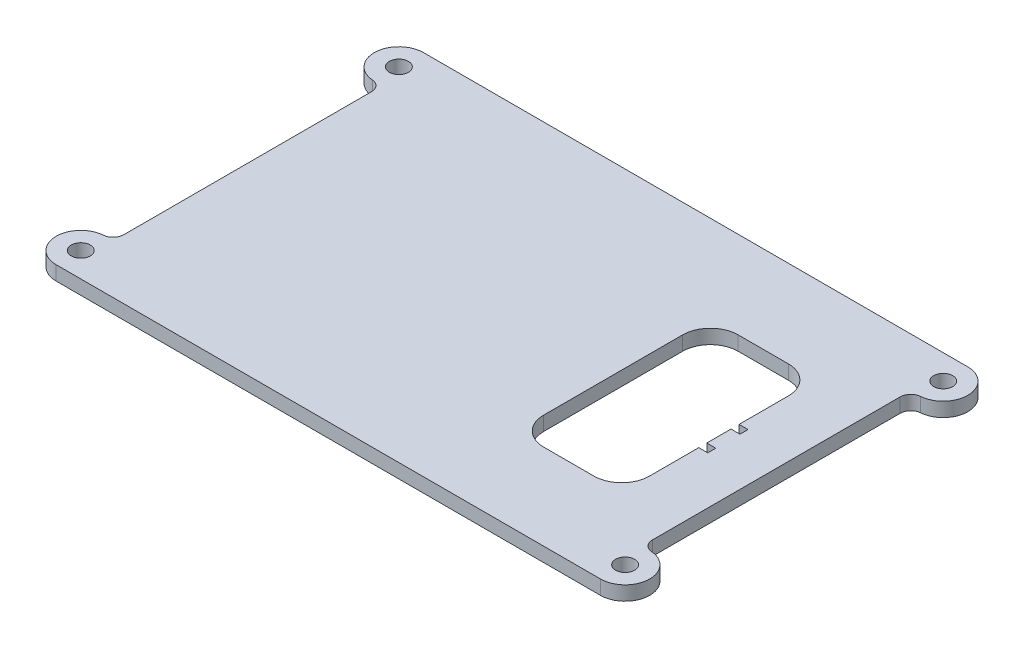
ISO-10303-21;
HEADER;
FILE_DESCRIPTION(('STEP AP214'),'2;1');
FILE_NAME('part.step','',(''),(''),'','','');
FILE_SCHEMA(('AUTOMOTIVE_DESIGN { 1 0 10303 214 1 1 1 1 }'));
ENDSEC;
DATA;
#1=APPLICATION_CONTEXT('core data for automotive mechanical design processes');
#2=APPLICATION_PROTOCOL_DEFINITION('international standard','automotive_design',2000,#1);
#3=PRODUCT_CONTEXT('',#1,'mechanical');
#4=PRODUCT('Part','Part','',(#3));
#5=PRODUCT_RELATED_PRODUCT_CATEGORY('part','',(#4));
#6=PRODUCT_DEFINITION_FORMATION('','',#4);
#7=PRODUCT_DEFINITION_CONTEXT('part definition',#1,'design');
#8=PRODUCT_DEFINITION('design','',#6,#7);
#9=PRODUCT_DEFINITION_SHAPE('','',#8);
#10=(LENGTH_UNIT() NAMED_UNIT(*) SI_UNIT(.MILLI.,.METRE.));
#11=(NAMED_UNIT(*) PLANE_ANGLE_UNIT() SI_UNIT($,.RADIAN.));
#12=(NAMED_UNIT(*) SI_UNIT($,.STERADIAN.) SOLID_ANGLE_UNIT());
#13=UNCERTAINTY_MEASURE_WITH_UNIT(LENGTH_MEASURE(1.E-05),#10,'distance_accuracy_value','');
#14=(GEOMETRIC_REPRESENTATION_CONTEXT(3) GLOBAL_UNCERTAINTY_ASSIGNED_CONTEXT((#13)) GLOBAL_UNIT_ASSIGNED_CONTEXT((#10,
#11,#12)) REPRESENTATION_CONTEXT('',''));
#15=CARTESIAN_POINT('',(0.,0.,0.));
#16=DIRECTION('',(0.,0.,1.));
#17=DIRECTION('',(1.,0.,0.));
#18=AXIS2_PLACEMENT_3D('',#15,#16,#17);
#19=CARTESIAN_POINT('',(0.,3.175,-39.380165211129));
#20=DIRECTION('',(0.,0.,1.));
#21=DIRECTION('',(1.,0.,0.));
#22=AXIS2_PLACEMENT_3D('',#19,#20,#21);
#23=PLANE('',#22);
#24=DIRECTION('',(-1.,0.,0.));
#25=VECTOR('',#24,1.);
#26=CARTESIAN_POINT('',(0.,0.,-39.380165211129));
#27=LINE('',#26,#25);
#28=CARTESIAN_POINT('',(54.5819086761113,0.,-39.380165211129));
#29=VERTEX_POINT('',#28);
#30=CARTESIAN_POINT('',(-66.9180913238887,0.,-39.380165211129));
#31=VERTEX_POINT('',#30);
#32=EDGE_CURVE('E319',#29,#31,#27,.T.);
#33=ORIENTED_EDGE('',*,*,#32,.T.);
#34=DIRECTION('',(0.,-1.,0.));
#35=VECTOR('',#34,1.);
#36=CARTESIAN_POINT('',(-66.9180913238887,3.175,-39.380165211129));
#37=LINE('',#36,#35);
#38=CARTESIAN_POINT('',(-66.9180913238887,3.175,-39.380165211129));
#39=VERTEX_POINT('',#38);
#40=EDGE_CURVE('E11',#39,#31,#37,.T.);
#41=ORIENTED_EDGE('',*,*,#40,.F.);
#42=DIRECTION('',(-1.,0.,0.));
#43=VECTOR('',#42,1.);
#44=CARTESIAN_POINT('',(0.,3.175,-39.380165211129));
#45=LINE('',#44,#43);
#46=CARTESIAN_POINT('',(54.5819086761113,3.175,-39.380165211129));
#47=VERTEX_POINT('',#46);
#48=EDGE_CURVE('E463',#47,#39,#45,.T.);
#49=ORIENTED_EDGE('',*,*,#48,.F.);
#50=DIRECTION('',(0.,-1.,0.));
#51=VECTOR('',#50,1.);
#52=CARTESIAN_POINT('',(54.5819086761113,3.175,-39.380165211129));
#53=LINE('',#52,#51);
#54=EDGE_CURVE('E349',#47,#29,#53,.T.);
#55=ORIENTED_EDGE('',*,*,#54,.T.);
#56=EDGE_LOOP('',(#33,#41,#49,#55));
#57=FACE_BOUND('',#56,.T.);
#58=ADVANCED_FACE('F41',(#57),#23,.F.);
#59=CARTESIAN_POINT('',(-66.9180913238887,3.175,-33.880165211129));
#60=DIRECTION('',(0.,-1.,0.));
#61=DIRECTION('',(0.,0.,-1.));
#62=AXIS2_PLACEMENT_3D('',#59,#60,#61);
#63=CYLINDRICAL_SURFACE('',#62,5.5);
#64=CARTESIAN_POINT('',(-66.9180913238887,0.,-33.880165211129));
#65=DIRECTION('',(0.,1.,0.));
#66=DIRECTION('',(0.,0.,1.));
#67=AXIS2_PLACEMENT_3D('',#64,#65,#66);
#68=CIRCLE('',#67,5.5);
#69=CARTESIAN_POINT('',(-67.3578121360715,0.,-28.3977710619153));
#70=VERTEX_POINT('',#69);
#71=EDGE_CURVE('E322',#31,#70,#68,.T.);
#72=ORIENTED_EDGE('',*,*,#71,.T.);
#73=DIRECTION('',(0.,-1.,0.));
#74=VECTOR('',#73,1.);
#75=CARTESIAN_POINT('',(-67.3578121360715,3.175,-28.3977710619153));
#76=LINE('',#75,#74);
#77=CARTESIAN_POINT('',(-67.3578121360715,3.175,-28.3977710619153));
#78=VERTEX_POINT('',#77);
#79=EDGE_CURVE('E51',#78,#70,#76,.T.);
#80=ORIENTED_EDGE('',*,*,#79,.F.);
#81=CARTESIAN_POINT('',(-66.9180913238887,3.175,-33.880165211129));
#82=DIRECTION('',(0.,1.,0.));
#83=DIRECTION('',(0.,0.,1.));
#84=AXIS2_PLACEMENT_3D('',#81,#82,#83);
#85=CIRCLE('',#84,5.5);
#86=EDGE_CURVE('E465',#39,#78,#85,.T.);
#87=ORIENTED_EDGE('',*,*,#86,.F.);
#88=ORIENTED_EDGE('',*,*,#40,.T.);
#89=EDGE_LOOP('',(#72,#80,#87,#88));
#90=FACE_BOUND('',#89,.T.);
#91=ADVANCED_FACE('F503',(#90),#63,.T.);
#92=CARTESIAN_POINT('',(-67.5480913238888,3.175,-26.0253895937101));
#93=DIRECTION('',(0.,-1.,0.));
#94=DIRECTION('',(0.,0.,-1.));
#95=AXIS2_PLACEMENT_3D('',#92,#93,#94);
#96=CYLINDRICAL_SURFACE('',#95,2.38);
#97=CARTESIAN_POINT('',(-67.5480913238888,0.,-26.0253895937101));
#98=DIRECTION('',(0.,1.,0.));
#99=DIRECTION('',(0.,0.,1.));
#100=AXIS2_PLACEMENT_3D('',#97,#98,#99);
#101=CIRCLE('',#100,2.38);
#102=CARTESIAN_POINT('',(-65.1680913238887,0.,-26.0253895937101));
#103=VERTEX_POINT('',#102);
#104=EDGE_CURVE('E325',#103,#70,#101,.T.);
#105=ORIENTED_EDGE('',*,*,#104,.F.);
#106=DIRECTION('',(0.,-1.,0.));
#107=VECTOR('',#106,1.);
#108=CARTESIAN_POINT('',(-65.1680913238887,3.175,-26.0253895937101));
#109=LINE('',#108,#107);
#110=CARTESIAN_POINT('',(-65.1680913238887,3.175,-26.0253895937101));
#111=VERTEX_POINT('',#110);
#112=EDGE_CURVE('E365',#111,#103,#109,.T.);
#113=ORIENTED_EDGE('',*,*,#112,.F.);
#114=CARTESIAN_POINT('',(-67.5480913238888,3.175,-26.0253895937101));
#115=DIRECTION('',(0.,1.,0.));
#116=DIRECTION('',(0.,0.,1.));
#117=AXIS2_PLACEMENT_3D('',#114,#115,#116);
#118=CIRCLE('',#117,2.38);
#119=EDGE_CURVE('E467',#111,#78,#118,.T.);
#120=ORIENTED_EDGE('',*,*,#119,.T.);
#121=ORIENTED_EDGE('',*,*,#79,.T.);
#122=EDGE_LOOP('',(#105,#113,#120,#121));
#123=FACE_BOUND('',#122,.T.);
#124=ADVANCED_FACE('F508',(#123),#96,.F.);
#125=CARTESIAN_POINT('',(-65.1680913238887,3.175,0.));
#126=DIRECTION('',(1.,0.,0.));
#127=DIRECTION('',(0.,0.,-1.));
#128=AXIS2_PLACEMENT_3D('',#125,#126,#127);
#129=PLANE('',#128);
#130=DIRECTION('',(0.,0.,1.));
#131=VECTOR('',#130,1.);
#132=CARTESIAN_POINT('',(-65.1680913238887,0.,0.));
#133=LINE('',#132,#131);
#134=CARTESIAN_POINT('',(-65.1680913238887,0.,29.265059171452));
#135=VERTEX_POINT('',#134);
#136=EDGE_CURVE('E328',#103,#135,#133,.T.);
#137=ORIENTED_EDGE('',*,*,#136,.T.);
#138=DIRECTION('',(0.,-1.,0.));
#139=VECTOR('',#138,1.);
#140=CARTESIAN_POINT('',(-65.1680913238887,3.175,29.265059171452));
#141=LINE('',#140,#139);
#142=CARTESIAN_POINT('',(-65.1680913238887,3.175,29.265059171452));
#143=VERTEX_POINT('',#142);
#144=EDGE_CURVE('E363',#143,#135,#141,.T.);
#145=ORIENTED_EDGE('',*,*,#144,.F.);
#146=DIRECTION('',(0.,0.,1.));
#147=VECTOR('',#146,1.);
#148=CARTESIAN_POINT('',(-65.1680913238887,3.175,0.));
#149=LINE('',#148,#147);
#150=EDGE_CURVE('E470',#111,#143,#149,.T.);
#151=ORIENTED_EDGE('',*,*,#150,.F.);
#152=ORIENTED_EDGE('',*,*,#112,.T.);
#153=EDGE_LOOP('',(#137,#145,#151,#152));
#154=FACE_BOUND('',#153,.T.);
#155=ADVANCED_FACE('F789',(#154),#129,.F.);
#156=CARTESIAN_POINT('',(-67.5480913238887,3.175,29.265059171452));
#157=DIRECTION('',(0.,-1.,0.));
#158=DIRECTION('',(0.,0.,-1.));
#159=AXIS2_PLACEMENT_3D('',#156,#157,#158);
#160=CYLINDRICAL_SURFACE('',#159,2.38);
#161=CARTESIAN_POINT('',(-67.5480913238887,0.,29.265059171452));
#162=DIRECTION('',(0.,1.,0.));
#163=DIRECTION('',(0.,0.,1.));
#164=AXIS2_PLACEMENT_3D('',#161,#162,#163);
#165=CIRCLE('',#164,2.38);
#166=CARTESIAN_POINT('',(-67.3578121360715,0.,31.6374406396572));
#167=VERTEX_POINT('',#166);
#168=EDGE_CURVE('E331',#167,#135,#165,.T.);
#169=ORIENTED_EDGE('',*,*,#168,.F.);
#170=DIRECTION('',(0.,-1.,0.));
#171=VECTOR('',#170,1.);
#172=CARTESIAN_POINT('',(-67.3578121360715,3.175,31.6374406396572));
#173=LINE('',#172,#171);
#174=CARTESIAN_POINT('',(-67.3578121360715,3.175,31.6374406396572));
#175=VERTEX_POINT('',#174);
#176=EDGE_CURVE('E361',#175,#167,#173,.T.);
#177=ORIENTED_EDGE('',*,*,#176,.F.);
#178=CARTESIAN_POINT('',(-67.5480913238887,3.175,29.265059171452));
#179=DIRECTION('',(0.,1.,0.));
#180=DIRECTION('',(0.,0.,1.));
#181=AXIS2_PLACEMENT_3D('',#178,#179,#180);
#182=CIRCLE('',#181,2.38);
#183=EDGE_CURVE('E472',#175,#143,#182,.T.);
#184=ORIENTED_EDGE('',*,*,#183,.T.);
#185=ORIENTED_EDGE('',*,*,#144,.T.);
#186=EDGE_LOOP('',(#169,#177,#184,#185));
#187=FACE_BOUND('',#186,.T.);
#188=ADVANCED_FACE('F779',(#187),#160,.F.);
#189=CARTESIAN_POINT('',(-66.9180913238887,3.175,37.119834788871));
#190=DIRECTION('',(0.,-1.,0.));
#191=DIRECTION('',(0.,0.,-1.));
#192=AXIS2_PLACEMENT_3D('',#189,#190,#191);
#193=CYLINDRICAL_SURFACE('',#192,5.5);
#194=CARTESIAN_POINT('',(-66.9180913238887,0.,37.119834788871));
#195=DIRECTION('',(0.,1.,0.));
#196=DIRECTION('',(0.,0.,1.));
#197=AXIS2_PLACEMENT_3D('',#194,#195,#196);
#198=CIRCLE('',#197,5.5);
#199=CARTESIAN_POINT('',(-66.9180913238887,0.,42.619834788871));
#200=VERTEX_POINT('',#199);
#201=EDGE_CURVE('E334',#167,#200,#198,.T.);
#202=ORIENTED_EDGE('',*,*,#201,.T.);
#203=DIRECTION('',(0.,-1.,0.));
#204=VECTOR('',#203,1.);
#205=CARTESIAN_POINT('',(-66.9180913238887,3.175,42.619834788871));
#206=LINE('',#205,#204);
#207=CARTESIAN_POINT('',(-66.9180913238887,3.175,42.619834788871));
#208=VERTEX_POINT('',#207);
#209=EDGE_CURVE('E358',#208,#200,#206,.T.);
#210=ORIENTED_EDGE('',*,*,#209,.F.);
#211=CARTESIAN_POINT('',(-66.9180913238887,3.175,37.119834788871));
#212=DIRECTION('',(0.,1.,0.));
#213=DIRECTION('',(0.,0.,1.));
#214=AXIS2_PLACEMENT_3D('',#211,#212,#213);
#215=CIRCLE('',#214,5.5);
#216=EDGE_CURVE('E475',#175,#208,#215,.T.);
#217=ORIENTED_EDGE('',*,*,#216,.F.);
#218=ORIENTED_EDGE('',*,*,#176,.T.);
#219=EDGE_LOOP('',(#202,#210,#217,#218));
#220=FACE_BOUND('',#219,.T.);
#221=ADVANCED_FACE('F769',(#220),#193,.T.);
#222=CARTESIAN_POINT('',(0.,3.175,42.619834788871));
#223=DIRECTION('',(0.,0.,-1.));
#224=DIRECTION('',(-1.,0.,0.));
#225=AXIS2_PLACEMENT_3D('',#222,#223,#224);
#226=PLANE('',#225);
#227=DIRECTION('',(1.,0.,0.));
#228=VECTOR('',#227,1.);
#229=CARTESIAN_POINT('',(0.,0.,42.619834788871));
#230=LINE('',#229,#228);
#231=CARTESIAN_POINT('',(54.5819086761113,0.,42.619834788871));
#232=VERTEX_POINT('',#231);
#233=EDGE_CURVE('E336',#200,#232,#230,.T.);
#234=ORIENTED_EDGE('',*,*,#233,.T.);
#235=DIRECTION('',(0.,-1.,0.));
#236=VECTOR('',#235,1.);
#237=CARTESIAN_POINT('',(54.5819086761113,3.175,42.619834788871));
#238=LINE('',#237,#236);
#239=CARTESIAN_POINT('',(54.5819086761113,3.175,42.619834788871));
#240=VERTEX_POINT('',#239);
#241=EDGE_CURVE('E355',#240,#232,#238,.T.);
#242=ORIENTED_EDGE('',*,*,#241,.F.);
#243=DIRECTION('',(1.,0.,0.));
#244=VECTOR('',#243,1.);
#245=CARTESIAN_POINT('',(0.,3.175,42.619834788871));
#246=LINE('',#245,#244);
#247=EDGE_CURVE('E477',#208,#240,#246,.T.);
#248=ORIENTED_EDGE('',*,*,#247,.F.);
#249=ORIENTED_EDGE('',*,*,#209,.T.);
#250=EDGE_LOOP('',(#234,#242,#248,#249));
#251=FACE_BOUND('',#250,.T.);
#252=ADVANCED_FACE('F759',(#251),#226,.F.);
#253=CARTESIAN_POINT('',(54.5819086761113,3.175,37.119834788871));
#254=DIRECTION('',(0.,-1.,0.));
#255=DIRECTION('',(0.,0.,-1.));
#256=AXIS2_PLACEMENT_3D('',#253,#254,#255);
#257=CYLINDRICAL_SURFACE('',#256,5.5);
#258=CARTESIAN_POINT('',(54.5819086761113,0.,37.119834788871));
#259=DIRECTION('',(0.,1.,0.));
#260=DIRECTION('',(0.,0.,1.));
#261=AXIS2_PLACEMENT_3D('',#258,#259,#260);
#262=CIRCLE('',#261,5.5);
#263=CARTESIAN_POINT('',(55.021629488294,0.,31.6374406396572));
#264=VERTEX_POINT('',#263);
#265=EDGE_CURVE('E338',#232,#264,#262,.T.);
#266=ORIENTED_EDGE('',*,*,#265,.T.);
#267=DIRECTION('',(0.,-1.,0.));
#268=VECTOR('',#267,1.);
#269=CARTESIAN_POINT('',(55.021629488294,3.175,31.6374406396572));
#270=LINE('',#269,#268);
#271=CARTESIAN_POINT('',(55.021629488294,3.175,31.6374406396572));
#272=VERTEX_POINT('',#271);
#273=EDGE_CURVE('E353',#272,#264,#270,.T.);
#274=ORIENTED_EDGE('',*,*,#273,.F.);
#275=CARTESIAN_POINT('',(54.5819086761113,3.175,37.119834788871));
#276=DIRECTION('',(0.,1.,0.));
#277=DIRECTION('',(0.,0.,1.));
#278=AXIS2_PLACEMENT_3D('',#275,#276,#277);
#279=CIRCLE('',#278,5.5);
#280=EDGE_CURVE('E479',#240,#272,#279,.T.);
#281=ORIENTED_EDGE('',*,*,#280,.F.);
#282=ORIENTED_EDGE('',*,*,#241,.T.);
#283=EDGE_LOOP('',(#266,#274,#281,#282));
#284=FACE_BOUND('',#283,.T.);
#285=ADVANCED_FACE('F750',(#284),#257,.T.);
#286=CARTESIAN_POINT('',(55.2119086761113,3.175,29.265059171452));
#287=DIRECTION('',(0.,-1.,0.));
#288=DIRECTION('',(0.,0.,-1.));
#289=AXIS2_PLACEMENT_3D('',#286,#287,#288);
#290=CYLINDRICAL_SURFACE('',#289,2.38);
#291=CARTESIAN_POINT('',(55.2119086761113,0.,29.265059171452));
#292=DIRECTION('',(0.,1.,0.));
#293=DIRECTION('',(0.,0.,1.));
#294=AXIS2_PLACEMENT_3D('',#291,#292,#293);
#295=CIRCLE('',#294,2.38);
#296=CARTESIAN_POINT('',(52.8319086761113,0.,29.265059171452));
#297=VERTEX_POINT('',#296);
#298=EDGE_CURVE('E341',#297,#264,#295,.T.);
#299=ORIENTED_EDGE('',*,*,#298,.F.);
#300=DIRECTION('',(0.,-1.,0.));
#301=VECTOR('',#300,1.);
#302=CARTESIAN_POINT('',(52.8319086761113,3.175,29.265059171452));
#303=LINE('',#302,#301);
#304=CARTESIAN_POINT('',(52.8319086761113,3.175,29.265059171452));
#305=VERTEX_POINT('',#304);
#306=EDGE_CURVE('E251',#305,#297,#303,.T.);
#307=ORIENTED_EDGE('',*,*,#306,.F.);
#308=CARTESIAN_POINT('',(55.2119086761113,3.175,29.265059171452));
#309=DIRECTION('',(0.,1.,0.));
#310=DIRECTION('',(0.,0.,1.));
#311=AXIS2_PLACEMENT_3D('',#308,#309,#310);
#312=CIRCLE('',#311,2.38);
#313=EDGE_CURVE('E240',#305,#272,#312,.T.);
#314=ORIENTED_EDGE('',*,*,#313,.T.);
#315=ORIENTED_EDGE('',*,*,#273,.T.);
#316=EDGE_LOOP('',(#299,#307,#314,#315));
#317=FACE_BOUND('',#316,.T.);
#318=ADVANCED_FACE('F482',(#317),#290,.F.);
#319=CARTESIAN_POINT('',(52.8319086761113,3.175,0.));
#320=DIRECTION('',(-1.,0.,0.));
#321=DIRECTION('',(0.,0.,1.));
#322=AXIS2_PLACEMENT_3D('',#319,#320,#321);
#323=PLANE('',#322);
#324=DIRECTION('',(0.,0.,-1.));
#325=VECTOR('',#324,1.);
#326=CARTESIAN_POINT('',(52.8319086761113,0.,0.));
#327=LINE('',#326,#325);
#328=CARTESIAN_POINT('',(52.8319086761112,0.,-26.0253895937101));
#329=VERTEX_POINT('',#328);
#330=EDGE_CURVE('E247',#297,#329,#327,.T.);
#331=ORIENTED_EDGE('',*,*,#330,.T.);
#332=DIRECTION('',(0.,-1.,0.));
#333=VECTOR('',#332,1.);
#334=CARTESIAN_POINT('',(52.8319086761112,3.175,-26.0253895937101));
#335=LINE('',#334,#333);
#336=CARTESIAN_POINT('',(52.8319086761112,3.175,-26.0253895937101));
#337=VERTEX_POINT('',#336);
#338=EDGE_CURVE('E244',#337,#329,#335,.T.);
#339=ORIENTED_EDGE('',*,*,#338,.F.);
#340=DIRECTION('',(0.,0.,-1.));
#341=VECTOR('',#340,1.);
#342=CARTESIAN_POINT('',(52.8319086761113,3.175,0.));
#343=LINE('',#342,#341);
#344=EDGE_CURVE('E234',#305,#337,#343,.T.);
#345=ORIENTED_EDGE('',*,*,#344,.F.);
#346=ORIENTED_EDGE('',*,*,#306,.T.);
#347=EDGE_LOOP('',(#331,#339,#345,#346));
#348=FACE_BOUND('',#347,.T.);
#349=ADVANCED_FACE('F245',(#348),#323,.F.);
#350=CARTESIAN_POINT('',(55.2119086761112,3.175,-26.0253895937101));
#351=DIRECTION('',(0.,-1.,0.));
#352=DIRECTION('',(0.,0.,-1.));
#353=AXIS2_PLACEMENT_3D('',#350,#351,#352);
#354=CYLINDRICAL_SURFACE('',#353,2.38);
#355=CARTESIAN_POINT('',(55.2119086761112,0.,-26.0253895937101));
#356=DIRECTION('',(0.,1.,0.));
#357=DIRECTION('',(0.,0.,1.));
#358=AXIS2_PLACEMENT_3D('',#355,#356,#357);
#359=CIRCLE('',#358,2.38);
#360=CARTESIAN_POINT('',(55.021629488294,0.,-28.3977710619153));
#361=VERTEX_POINT('',#360);
#362=EDGE_CURVE('E345',#361,#329,#359,.T.);
#363=ORIENTED_EDGE('',*,*,#362,.F.);
#364=DIRECTION('',(0.,-1.,0.));
#365=VECTOR('',#364,1.);
#366=CARTESIAN_POINT('',(55.021629488294,3.175,-28.3977710619153));
#367=LINE('',#366,#365);
#368=CARTESIAN_POINT('',(55.021629488294,3.175,-28.3977710619153));
#369=VERTEX_POINT('',#368);
#370=EDGE_CURVE('E148',#369,#361,#367,.T.);
#371=ORIENTED_EDGE('',*,*,#370,.F.);
#372=CARTESIAN_POINT('',(55.2119086761112,3.175,-26.0253895937101));
#373=DIRECTION('',(0.,1.,0.));
#374=DIRECTION('',(0.,0.,1.));
#375=AXIS2_PLACEMENT_3D('',#372,#373,#374);
#376=CIRCLE('',#375,2.38);
#377=EDGE_CURVE('E238',#369,#337,#376,.T.);
#378=ORIENTED_EDGE('',*,*,#377,.T.);
#379=ORIENTED_EDGE('',*,*,#338,.T.);
#380=EDGE_LOOP('',(#363,#371,#378,#379));
#381=FACE_BOUND('',#380,.T.);
#382=ADVANCED_FACE('F253',(#381),#354,.F.);
#383=CARTESIAN_POINT('',(33.9639080029856,3.175,-13.7351666511994));
#384=DIRECTION('',(0.,-1.,0.));
#385=DIRECTION('',(0.,0.,-1.));
#386=AXIS2_PLACEMENT_3D('',#383,#384,#385);
#387=CYLINDRICAL_SURFACE('',#386,6.19999999999999);
#388=CARTESIAN_POINT('',(33.9639080029856,0.,-13.7351666511994));
#389=DIRECTION('',(0.,1.,0.));
#390=DIRECTION('',(0.,0.,1.));
#391=AXIS2_PLACEMENT_3D('',#388,#389,#390);
#392=CIRCLE('',#391,6.19999999999999);
#393=CARTESIAN_POINT('',(40.1639080029856,0.,-13.7351667251336));
#394=VERTEX_POINT('',#393);
#395=CARTESIAN_POINT('',(33.9639079290513,0.,-19.9351666511994));
#396=VERTEX_POINT('',#395);
#397=EDGE_CURVE('E271',#394,#396,#392,.T.);
#398=ORIENTED_EDGE('',*,*,#397,.F.);
#399=DIRECTION('',(0.,-1.,0.));
#400=VECTOR('',#399,1.);
#401=CARTESIAN_POINT('',(40.1639080029856,3.175,-13.7351667251336));
#402=LINE('',#401,#400);
#403=CARTESIAN_POINT('',(40.1639080029856,3.175,-13.7351667251336));
#404=VERTEX_POINT('',#403);
#405=EDGE_CURVE('E45',#404,#394,#402,.T.);
#406=ORIENTED_EDGE('',*,*,#405,.F.);
#407=CARTESIAN_POINT('',(33.9639080029856,3.175,-13.7351666511994));
#408=DIRECTION('',(0.,1.,0.));
#409=DIRECTION('',(0.,0.,1.));
#410=AXIS2_PLACEMENT_3D('',#407,#408,#409);
#411=CIRCLE('',#410,6.19999999999999);
#412=CARTESIAN_POINT('',(33.9639079290513,3.175,-19.9351666511994));
#413=VERTEX_POINT('',#412);
#414=EDGE_CURVE('E426',#404,#413,#411,.T.);
#415=ORIENTED_EDGE('',*,*,#414,.T.);
#416=DIRECTION('',(0.,-1.,0.));
#417=VECTOR('',#416,1.);
#418=CARTESIAN_POINT('',(33.9639079290513,3.175,-19.9351666511994));
#419=LINE('',#418,#417);
#420=EDGE_CURVE('E255',#413,#396,#419,.T.);
#421=ORIENTED_EDGE('',*,*,#420,.T.);
#422=EDGE_LOOP('',(#398,#406,#415,#421));
#423=FACE_BOUND('',#422,.T.);
#424=ADVANCED_FACE('F407',(#423),#387,.F.);
#425=CARTESIAN_POINT('',(40.1639081667758,3.175,-4.7894989761416E-07));
#426=DIRECTION('',(-1.,0.,1.19248827983915E-08));
#427=DIRECTION('',(1.19248827983915E-08,0.,1.));
#428=AXIS2_PLACEMENT_3D('',#425,#426,#427);
#429=PLANE('',#428);
#430=DIRECTION('',(-1.19248827983915E-08,0.,-1.));
#431=VECTOR('',#430,1.);
#432=CARTESIAN_POINT('',(40.1639081667758,0.,-4.7894989761416E-07));
#433=LINE('',#432,#431);
#434=CARTESIAN_POINT('',(40.1639081341593,0.,-2.73516672513364));
#435=VERTEX_POINT('',#434);
#436=EDGE_CURVE('E274',#435,#394,#433,.T.);
#437=ORIENTED_EDGE('',*,*,#436,.F.);
#438=DIRECTION('',(0.,-1.,0.));
#439=VECTOR('',#438,1.);
#440=CARTESIAN_POINT('',(40.1639081341593,3.175,-2.73516672513364));
#441=LINE('',#440,#439);
#442=CARTESIAN_POINT('',(40.1639081341593,3.175,-2.73516672513364));
#443=VERTEX_POINT('',#442);
#444=EDGE_CURVE('E397',#443,#435,#441,.T.);
#445=ORIENTED_EDGE('',*,*,#444,.F.);
#446=DIRECTION('',(-1.19248827983915E-08,0.,-1.));
#447=VECTOR('',#446,1.);
#448=CARTESIAN_POINT('',(40.1639081667758,3.175,-4.7894989761416E-07));
#449=LINE('',#448,#447);
#450=EDGE_CURVE('E406',#443,#404,#449,.T.);
#451=ORIENTED_EDGE('',*,*,#450,.T.);
#452=ORIENTED_EDGE('',*,*,#405,.T.);
#453=EDGE_LOOP('',(#437,#445,#451,#452));
#454=FACE_BOUND('',#453,.T.);
#455=ADVANCED_FACE('F404',(#454),#429,.T.);
#456=CARTESIAN_POINT('',(-3.26165326064427E-08,3.175,-2.7351662461838));
#457=DIRECTION('',(-1.19248812213701E-08,0.,-1.));
#458=DIRECTION('',(-1.,0.,1.19248812213701E-08));
#459=AXIS2_PLACEMENT_3D('',#456,#457,#458);
#460=PLANE('',#459);
#461=DIRECTION('',(1.,0.,-1.19248812213701E-08));
#462=VECTOR('',#461,1.);
#463=CARTESIAN_POINT('',(-3.26165326064427E-08,0.,-2.7351662461838));
#464=LINE('',#463,#462);
#465=CARTESIAN_POINT('',(42.1639081341593,0.,-2.7351667489834));
#466=VERTEX_POINT('',#465);
#467=EDGE_CURVE('E277',#435,#466,#464,.T.);
#468=ORIENTED_EDGE('',*,*,#467,.T.);
#469=DIRECTION('',(0.,-1.,0.));
#470=VECTOR('',#469,1.);
#471=CARTESIAN_POINT('',(42.1639081341593,3.175,-2.7351667489834));
#472=LINE('',#471,#470);
#473=CARTESIAN_POINT('',(42.1639081341593,3.175,-2.7351667489834));
#474=VERTEX_POINT('',#473);
#475=EDGE_CURVE('E395',#474,#466,#472,.T.);
#476=ORIENTED_EDGE('',*,*,#475,.F.);
#477=DIRECTION('',(1.,0.,-1.19248812213701E-08));
#478=VECTOR('',#477,1.);
#479=CARTESIAN_POINT('',(-3.26165326064427E-08,3.175,-2.7351662461838));
#480=LINE('',#479,#478);
#481=EDGE_CURVE('E415',#443,#474,#480,.T.);
#482=ORIENTED_EDGE('',*,*,#481,.F.);
#483=ORIENTED_EDGE('',*,*,#444,.T.);
#484=EDGE_LOOP('',(#468,#476,#482,#483));
#485=FACE_BOUND('',#484,.T.);
#486=ADVANCED_FACE('F413',(#485),#460,.F.);
#487=CARTESIAN_POINT('',(42.1639081667758,3.175,-5.02799320400612E-07));
#488=DIRECTION('',(1.,0.,-1.19248746679703E-08));
#489=DIRECTION('',(-1.19248746679703E-08,0.,-1.));
#490=AXIS2_PLACEMENT_3D('',#487,#488,#489);
#491=PLANE('',#490);
#492=DIRECTION('',(1.19248746679703E-08,0.,1.));
#493=VECTOR('',#492,1.);
#494=CARTESIAN_POINT('',(42.1639081667758,0.,-5.02799320400612E-07));
#495=LINE('',#494,#493);
#496=CARTESIAN_POINT('',(42.1639081556241,0.,-0.935166748983397));
#497=VERTEX_POINT('',#496);
#498=EDGE_CURVE('E280',#466,#497,#495,.T.);
#499=ORIENTED_EDGE('',*,*,#498,.T.);
#500=DIRECTION('',(0.,-1.,0.));
#501=VECTOR('',#500,1.);
#502=CARTESIAN_POINT('',(42.1639081556241,3.175,-0.935166748983397));
#503=LINE('',#502,#501);
#504=CARTESIAN_POINT('',(42.1639081556241,3.175,-0.935166748983397));
#505=VERTEX_POINT('',#504);
#506=EDGE_CURVE('E393',#505,#497,#503,.T.);
#507=ORIENTED_EDGE('',*,*,#506,.F.);
#508=DIRECTION('',(1.19248746679703E-08,0.,1.));
#509=VECTOR('',#508,1.);
#510=CARTESIAN_POINT('',(42.1639081667758,3.175,-5.02799320400612E-07));
#511=LINE('',#510,#509);
#512=EDGE_CURVE('E419',#474,#505,#511,.T.);
#513=ORIENTED_EDGE('',*,*,#512,.F.);
#514=ORIENTED_EDGE('',*,*,#475,.T.);
#515=EDGE_LOOP('',(#499,#507,#513,#514));
#516=FACE_BOUND('',#515,.T.);
#517=ADVANCED_FACE('F417',(#516),#491,.F.);
#518=CARTESIAN_POINT('',(-1.11517464079764E-08,3.175,-0.935166246183801));
#519=DIRECTION('',(-1.19248812213701E-08,0.,-1.));
#520=DIRECTION('',(-1.,0.,1.19248812213701E-08));
#521=AXIS2_PLACEMENT_3D('',#518,#519,#520);
#522=PLANE('',#521);
#523=DIRECTION('',(1.,0.,-1.19248812213701E-08));
#524=VECTOR('',#523,1.);
#525=CARTESIAN_POINT('',(-1.11517464079764E-08,0.,-0.935166246183801));
#526=LINE('',#525,#524);
#527=CARTESIAN_POINT('',(40.1639081556241,0.,-0.935166725133635));
#528=VERTEX_POINT('',#527);
#529=EDGE_CURVE('E283',#528,#497,#526,.T.);
#530=ORIENTED_EDGE('',*,*,#529,.F.);
#531=DIRECTION('',(0.,-1.,0.));
#532=VECTOR('',#531,1.);
#533=CARTESIAN_POINT('',(40.1639081556241,3.175,-0.935166725133635));
#534=LINE('',#533,#532);
#535=CARTESIAN_POINT('',(40.1639081556241,3.175,-0.935166725133635));
#536=VERTEX_POINT('',#535);
#537=EDGE_CURVE('E391',#536,#528,#534,.T.);
#538=ORIENTED_EDGE('',*,*,#537,.F.);
#539=DIRECTION('',(1.,0.,-1.19248812213701E-08));
#540=VECTOR('',#539,1.);
#541=CARTESIAN_POINT('',(-1.11517464079764E-08,3.175,-0.935166246183801));
#542=LINE('',#541,#540);
#543=EDGE_CURVE('E423',#536,#505,#542,.T.);
#544=ORIENTED_EDGE('',*,*,#543,.T.);
#545=ORIENTED_EDGE('',*,*,#506,.T.);
#546=EDGE_LOOP('',(#530,#538,#544,#545));
#547=FACE_BOUND('',#546,.T.);
#548=ADVANCED_FACE('F557',(#547),#522,.T.);
#549=CARTESIAN_POINT('',(40.1639081667758,3.175,-4.78949777504004E-07));
#550=DIRECTION('',(1.,0.,-1.19248798078918E-08));
#551=DIRECTION('',(-1.19248798078918E-08,0.,-1.));
#552=AXIS2_PLACEMENT_3D('',#549,#550,#551);
#553=PLANE('',#552);
#554=DIRECTION('',(1.19248798078918E-08,0.,1.));
#555=VECTOR('',#554,1.);
#556=CARTESIAN_POINT('',(40.1639081667758,0.,-4.78949777504004E-07));
#557=LINE('',#556,#555);
#558=CARTESIAN_POINT('',(40.1639082200184,0.,4.46483327486637));
#559=VERTEX_POINT('',#558);
#560=EDGE_CURVE('E286',#528,#559,#557,.T.);
#561=ORIENTED_EDGE('',*,*,#560,.T.);
#562=DIRECTION('',(0.,-1.,0.));
#563=VECTOR('',#562,1.);
#564=CARTESIAN_POINT('',(40.1639082200184,3.175,4.46483327486637));
#565=LINE('',#564,#563);
#566=CARTESIAN_POINT('',(40.1639082200184,3.175,4.46483327486637));
#567=VERTEX_POINT('',#566);
#568=EDGE_CURVE('E388',#567,#559,#565,.T.);
#569=ORIENTED_EDGE('',*,*,#568,.F.);
#570=DIRECTION('',(1.19248798078918E-08,0.,1.));
#571=VECTOR('',#570,1.);
#572=CARTESIAN_POINT('',(40.1639081667758,3.175,-4.78949777504004E-07));
#573=LINE('',#572,#571);
#574=EDGE_CURVE('E431',#536,#567,#573,.T.);
#575=ORIENTED_EDGE('',*,*,#574,.F.);
#576=ORIENTED_EDGE('',*,*,#537,.T.);
#577=EDGE_LOOP('',(#561,#569,#575,#576));
#578=FACE_BOUND('',#577,.T.);
#579=ADVANCED_FACE('F553',(#578),#553,.F.);
#580=CARTESIAN_POINT('',(5.32426121874223E-08,3.175,4.4648337538162));
#581=DIRECTION('',(-1.19248812213701E-08,0.,-1.));
#582=DIRECTION('',(-1.,0.,1.19248812213701E-08));
#583=AXIS2_PLACEMENT_3D('',#580,#581,#582);
#584=PLANE('',#583);
#585=DIRECTION('',(1.,0.,-1.19248812213701E-08));
#586=VECTOR('',#585,1.);
#587=CARTESIAN_POINT('',(5.32426121874223E-08,0.,4.4648337538162));
#588=LINE('',#587,#586);
#589=CARTESIAN_POINT('',(42.1639082200184,0.,4.4648332510166));
#590=VERTEX_POINT('',#589);
#591=EDGE_CURVE('E289',#559,#590,#588,.T.);
#592=ORIENTED_EDGE('',*,*,#591,.T.);
#593=DIRECTION('',(0.,-1.,0.));
#594=VECTOR('',#593,1.);
#595=CARTESIAN_POINT('',(42.1639082200184,3.175,4.4648332510166));
#596=LINE('',#595,#594);
#597=CARTESIAN_POINT('',(42.1639082200184,3.175,4.4648332510166));
#598=VERTEX_POINT('',#597);
#599=EDGE_CURVE('E385',#598,#590,#596,.T.);
#600=ORIENTED_EDGE('',*,*,#599,.F.);
#601=DIRECTION('',(1.,0.,-1.19248812213701E-08));
#602=VECTOR('',#601,1.);
#603=CARTESIAN_POINT('',(5.32426121874223E-08,3.175,4.4648337538162));
#604=LINE('',#603,#602);
#605=EDGE_CURVE('E434',#567,#598,#604,.T.);
#606=ORIENTED_EDGE('',*,*,#605,.F.);
#607=ORIENTED_EDGE('',*,*,#568,.T.);
#608=EDGE_LOOP('',(#592,#600,#606,#607));
#609=FACE_BOUND('',#608,.T.);
#610=ADVANCED_FACE('F549',(#609),#584,.F.);
#611=CARTESIAN_POINT('',(42.1639081667758,3.175,-5.02799970558137E-07));
#612=DIRECTION('',(1.,0.,-1.19248900877346E-08));
#613=DIRECTION('',(-1.19248900877346E-08,0.,-1.));
#614=AXIS2_PLACEMENT_3D('',#611,#612,#613);
#615=PLANE('',#614);
#616=DIRECTION('',(1.19248900877346E-08,0.,1.));
#617=VECTOR('',#616,1.);
#618=CARTESIAN_POINT('',(42.1639081667758,0.,-5.02799970558137E-07));
#619=LINE('',#618,#617);
#620=CARTESIAN_POINT('',(42.1639082414832,0.,6.2648332510166));
#621=VERTEX_POINT('',#620);
#622=EDGE_CURVE('E292',#590,#621,#619,.T.);
#623=ORIENTED_EDGE('',*,*,#622,.T.);
#624=DIRECTION('',(0.,-1.,0.));
#625=VECTOR('',#624,1.);
#626=CARTESIAN_POINT('',(42.1639082414832,3.175,6.2648332510166));
#627=LINE('',#626,#625);
#628=CARTESIAN_POINT('',(42.1639082414832,3.175,6.2648332510166));
#629=VERTEX_POINT('',#628);
#630=EDGE_CURVE('E383',#629,#621,#627,.T.);
#631=ORIENTED_EDGE('',*,*,#630,.F.);
#632=DIRECTION('',(1.19248900877346E-08,0.,1.));
#633=VECTOR('',#632,1.);
#634=CARTESIAN_POINT('',(42.1639081667758,3.175,-5.02799970558137E-07));
#635=LINE('',#634,#633);
#636=EDGE_CURVE('E437',#598,#629,#635,.T.);
#637=ORIENTED_EDGE('',*,*,#636,.F.);
#638=ORIENTED_EDGE('',*,*,#599,.T.);
#639=EDGE_LOOP('',(#623,#631,#637,#638));
#640=FACE_BOUND('',#639,.T.);
#641=ADVANCED_FACE('F545',(#640),#615,.F.);
#642=CARTESIAN_POINT('',(7.47073983858886E-08,3.175,6.2648337538162));
#643=DIRECTION('',(-1.19248812213701E-08,0.,-1.));
#644=DIRECTION('',(-1.,0.,1.19248812213701E-08));
#645=AXIS2_PLACEMENT_3D('',#642,#643,#644);
#646=PLANE('',#645);
#647=DIRECTION('',(1.,0.,-1.19248812213701E-08));
#648=VECTOR('',#647,1.);
#649=CARTESIAN_POINT('',(7.47073983858886E-08,0.,6.2648337538162));
#650=LINE('',#649,#648);
#651=CARTESIAN_POINT('',(40.1639082414832,0.,6.26483327486636));
#652=VERTEX_POINT('',#651);
#653=EDGE_CURVE('E295',#652,#621,#650,.T.);
#654=ORIENTED_EDGE('',*,*,#653,.F.);
#655=DIRECTION('',(0.,-1.,0.));
#656=VECTOR('',#655,1.);
#657=CARTESIAN_POINT('',(40.1639082414832,3.175,6.26483327486636));
#658=LINE('',#657,#656);
#659=CARTESIAN_POINT('',(40.1639082414832,3.175,6.26483327486636));
#660=VERTEX_POINT('',#659);
#661=EDGE_CURVE('E381',#660,#652,#658,.T.);
#662=ORIENTED_EDGE('',*,*,#661,.F.);
#663=DIRECTION('',(1.,0.,-1.19248812213701E-08));
#664=VECTOR('',#663,1.);
#665=CARTESIAN_POINT('',(7.47073983858886E-08,3.175,6.2648337538162));
#666=LINE('',#665,#664);
#667=EDGE_CURVE('E439',#660,#629,#666,.T.);
#668=ORIENTED_EDGE('',*,*,#667,.T.);
#669=ORIENTED_EDGE('',*,*,#630,.T.);
#670=EDGE_LOOP('',(#654,#662,#668,#669));
#671=FACE_BOUND('',#670,.T.);
#672=ADVANCED_FACE('F541',(#671),#646,.T.);
#673=CARTESIAN_POINT('',(40.1639081667758,3.175,-4.78949796271216E-07));
#674=DIRECTION('',(-1.,0.,1.19248802751573E-08));
#675=DIRECTION('',(1.19248802751573E-08,0.,1.));
#676=AXIS2_PLACEMENT_3D('',#673,#674,#675);
#677=PLANE('',#676);
#678=DIRECTION('',(-1.19248802751573E-08,0.,-1.));
#679=VECTOR('',#678,1.);
#680=CARTESIAN_POINT('',(40.1639081667758,0.,-4.78949796271216E-07));
#681=LINE('',#680,#679);
#682=CARTESIAN_POINT('',(40.1639083726569,0.,17.2648332748664));
#683=VERTEX_POINT('',#682);
#684=EDGE_CURVE('E298',#683,#652,#681,.T.);
#685=ORIENTED_EDGE('',*,*,#684,.F.);
#686=DIRECTION('',(0.,-1.,0.));
#687=VECTOR('',#686,1.);
#688=CARTESIAN_POINT('',(40.1639083726569,3.175,17.2648332748664));
#689=LINE('',#688,#687);
#690=CARTESIAN_POINT('',(40.1639083726569,3.175,17.2648332748664));
#691=VERTEX_POINT('',#690);
#692=EDGE_CURVE('E379',#691,#683,#689,.T.);
#693=ORIENTED_EDGE('',*,*,#692,.F.);
#694=DIRECTION('',(-1.19248802751573E-08,0.,-1.));
#695=VECTOR('',#694,1.);
#696=CARTESIAN_POINT('',(40.1639081667758,3.175,-4.78949796271216E-07));
#697=LINE('',#696,#695);
#698=EDGE_CURVE('E442',#691,#660,#697,.T.);
#699=ORIENTED_EDGE('',*,*,#698,.T.);
#700=ORIENTED_EDGE('',*,*,#661,.T.);
#701=EDGE_LOOP('',(#685,#693,#699,#700));
#702=FACE_BOUND('',#701,.T.);
#703=ADVANCED_FACE('F537',(#702),#677,.T.);
#704=CARTESIAN_POINT('',(33.9639083726569,3.175,17.2648333488006));
#705=DIRECTION('',(0.,-1.,0.));
#706=DIRECTION('',(0.,0.,-1.));
#707=AXIS2_PLACEMENT_3D('',#704,#705,#706);
#708=CYLINDRICAL_SURFACE('',#707,6.19999999999999);
#709=CARTESIAN_POINT('',(33.9639083726569,0.,17.2648333488006));
#710=DIRECTION('',(0.,1.,0.));
#711=DIRECTION('',(0.,0.,1.));
#712=AXIS2_PLACEMENT_3D('',#709,#710,#711);
#713=CIRCLE('',#712,6.19999999999999);
#714=CARTESIAN_POINT('',(33.9639084465912,0.,23.4648333488006));
#715=VERTEX_POINT('',#714);
#716=EDGE_CURVE('E301',#715,#683,#713,.T.);
#717=ORIENTED_EDGE('',*,*,#716,.F.);
#718=DIRECTION('',(0.,-1.,0.));
#719=VECTOR('',#718,1.);
#720=CARTESIAN_POINT('',(33.9639084465912,3.175,23.4648333488006));
#721=LINE('',#720,#719);
#722=CARTESIAN_POINT('',(33.9639084465912,3.175,23.4648333488006));
#723=VERTEX_POINT('',#722);
#724=EDGE_CURVE('E377',#723,#715,#721,.T.);
#725=ORIENTED_EDGE('',*,*,#724,.F.);
#726=CARTESIAN_POINT('',(33.9639083726569,3.175,17.2648333488006));
#727=DIRECTION('',(0.,1.,0.));
#728=DIRECTION('',(0.,0.,1.));
#729=AXIS2_PLACEMENT_3D('',#726,#727,#728);
#730=CIRCLE('',#729,6.19999999999999);
#731=EDGE_CURVE('E445',#723,#691,#730,.T.);
#732=ORIENTED_EDGE('',*,*,#731,.T.);
#733=ORIENTED_EDGE('',*,*,#692,.T.);
#734=EDGE_LOOP('',(#717,#725,#732,#733));
#735=FACE_BOUND('',#734,.T.);
#736=ADVANCED_FACE('F533',(#735),#708,.F.);
#737=CARTESIAN_POINT('',(2.79815343763455E-07,3.175,23.4648337538162));
#738=DIRECTION('',(-1.19248807257349E-08,0.,-1.));
#739=DIRECTION('',(-1.,0.,1.19248807257349E-08));
#740=AXIS2_PLACEMENT_3D('',#737,#738,#739);
#741=PLANE('',#740);
#742=DIRECTION('',(1.,0.,-1.19248807257349E-08));
#743=VECTOR('',#742,1.);
#744=CARTESIAN_POINT('',(2.79815343763455E-07,0.,23.4648337538162));
#745=LINE('',#744,#743);
#746=CARTESIAN_POINT('',(22.7639084465912,0.,23.4648334823593));
#747=VERTEX_POINT('',#746);
#748=EDGE_CURVE('E304',#747,#715,#745,.T.);
#749=ORIENTED_EDGE('',*,*,#748,.F.);
#750=DIRECTION('',(0.,-1.,0.));
#751=VECTOR('',#750,1.);
#752=CARTESIAN_POINT('',(22.7639084465912,3.175,23.4648334823593));
#753=LINE('',#752,#751);
#754=CARTESIAN_POINT('',(22.7639084465912,3.175,23.4648334823593));
#755=VERTEX_POINT('',#754);
#756=EDGE_CURVE('E375',#755,#747,#753,.T.);
#757=ORIENTED_EDGE('',*,*,#756,.F.);
#758=DIRECTION('',(1.,0.,-1.19248807257349E-08));
#759=VECTOR('',#758,1.);
#760=CARTESIAN_POINT('',(2.79815343763455E-07,3.175,23.4648337538162));
#761=LINE('',#760,#759);
#762=EDGE_CURVE('E448',#755,#723,#761,.T.);
#763=ORIENTED_EDGE('',*,*,#762,.T.);
#764=ORIENTED_EDGE('',*,*,#724,.T.);
#765=EDGE_LOOP('',(#749,#757,#763,#764));
#766=FACE_BOUND('',#765,.T.);
#767=ADVANCED_FACE('F529',(#766),#741,.T.);
#768=CARTESIAN_POINT('',(22.7639083726569,3.175,17.2648334823593));
#769=DIRECTION('',(0.,-1.,0.));
#770=DIRECTION('',(0.,0.,-1.));
#771=AXIS2_PLACEMENT_3D('',#768,#769,#770);
#772=CYLINDRICAL_SURFACE('',#771,6.2);
#773=CARTESIAN_POINT('',(22.7639083726569,0.,17.2648334823593));
#774=DIRECTION('',(0.,1.,0.));
#775=DIRECTION('',(0.,0.,1.));
#776=AXIS2_PLACEMENT_3D('',#773,#774,#775);
#777=CIRCLE('',#776,6.2);
#778=CARTESIAN_POINT('',(16.5639083726569,0.,17.2648335562936));
#779=VERTEX_POINT('',#778);
#780=EDGE_CURVE('E307',#779,#747,#777,.T.);
#781=ORIENTED_EDGE('',*,*,#780,.F.);
#782=DIRECTION('',(0.,-1.,0.));
#783=VECTOR('',#782,1.);
#784=CARTESIAN_POINT('',(16.5639083726569,3.175,17.2648335562936));
#785=LINE('',#784,#783);
#786=CARTESIAN_POINT('',(16.5639083726569,3.175,17.2648335562936));
#787=VERTEX_POINT('',#786);
#788=EDGE_CURVE('E373',#787,#779,#785,.T.);
#789=ORIENTED_EDGE('',*,*,#788,.F.);
#790=CARTESIAN_POINT('',(22.7639083726569,3.175,17.2648334823593));
#791=DIRECTION('',(0.,1.,0.));
#792=DIRECTION('',(0.,0.,1.));
#793=AXIS2_PLACEMENT_3D('',#790,#791,#792);
#794=CIRCLE('',#793,6.2);
#795=EDGE_CURVE('E451',#787,#755,#794,.T.);
#796=ORIENTED_EDGE('',*,*,#795,.T.);
#797=ORIENTED_EDGE('',*,*,#756,.T.);
#798=EDGE_LOOP('',(#781,#789,#796,#797));
#799=FACE_BOUND('',#798,.T.);
#800=ADVANCED_FACE('F525',(#799),#772,.F.);
#801=CARTESIAN_POINT('',(16.5639081667758,3.175,-1.97522631889104E-07));
#802=DIRECTION('',(1.,0.,-1.19248808856172E-08));
#803=DIRECTION('',(-1.19248808856172E-08,0.,-1.));
#804=AXIS2_PLACEMENT_3D('',#801,#802,#803);
#805=PLANE('',#804);
#806=DIRECTION('',(1.19248808856172E-08,0.,1.));
#807=VECTOR('',#806,1.);
#808=CARTESIAN_POINT('',(16.5639081667758,0.,-1.97522631889104E-07));
#809=LINE('',#808,#807);
#810=CARTESIAN_POINT('',(16.5639080029856,0.,-13.7351664437064));
#811=VERTEX_POINT('',#810);
#812=EDGE_CURVE('E310',#811,#779,#809,.T.);
#813=ORIENTED_EDGE('',*,*,#812,.F.);
#814=DIRECTION('',(0.,-1.,0.));
#815=VECTOR('',#814,1.);
#816=CARTESIAN_POINT('',(16.5639080029856,3.175,-13.7351664437064));
#817=LINE('',#816,#815);
#818=CARTESIAN_POINT('',(16.5639080029856,3.175,-13.7351664437064));
#819=VERTEX_POINT('',#818);
#820=EDGE_CURVE('E371',#819,#811,#817,.T.);
#821=ORIENTED_EDGE('',*,*,#820,.F.);
#822=DIRECTION('',(1.19248808856172E-08,0.,1.));
#823=VECTOR('',#822,1.);
#824=CARTESIAN_POINT('',(16.5639081667758,3.175,-1.97522631889104E-07));
#825=LINE('',#824,#823);
#826=EDGE_CURVE('E454',#819,#787,#825,.T.);
#827=ORIENTED_EDGE('',*,*,#826,.T.);
#828=ORIENTED_EDGE('',*,*,#788,.T.);
#829=EDGE_LOOP('',(#813,#821,#827,#828));
#830=FACE_BOUND('',#829,.T.);
#831=ADVANCED_FACE('F521',(#830),#805,.T.);
#832=CARTESIAN_POINT('',(22.7639080029856,3.175,-13.7351665176407));
#833=DIRECTION('',(0.,-1.,0.));
#834=DIRECTION('',(0.,0.,-1.));
#835=AXIS2_PLACEMENT_3D('',#832,#833,#834);
#836=CYLINDRICAL_SURFACE('',#835,6.2);
#837=CARTESIAN_POINT('',(22.7639080029856,0.,-13.7351665176407));
#838=DIRECTION('',(0.,1.,0.));
#839=DIRECTION('',(0.,0.,1.));
#840=AXIS2_PLACEMENT_3D('',#837,#838,#839);
#841=CIRCLE('',#840,6.2);
#842=CARTESIAN_POINT('',(22.7639079290513,0.,-19.9351665176407));
#843=VERTEX_POINT('',#842);
#844=EDGE_CURVE('E313',#843,#811,#841,.T.);
#845=ORIENTED_EDGE('',*,*,#844,.F.);
#846=DIRECTION('',(0.,-1.,0.));
#847=VECTOR('',#846,1.);
#848=CARTESIAN_POINT('',(22.7639079290513,3.175,-19.9351665176407));
#849=LINE('',#848,#847);
#850=CARTESIAN_POINT('',(22.7639079290513,3.175,-19.9351665176407));
#851=VERTEX_POINT('',#850);
#852=EDGE_CURVE('E369',#851,#843,#849,.T.);
#853=ORIENTED_EDGE('',*,*,#852,.F.);
#854=CARTESIAN_POINT('',(22.7639080029856,3.175,-13.7351665176407));
#855=DIRECTION('',(0.,1.,0.));
#856=DIRECTION('',(0.,0.,1.));
#857=AXIS2_PLACEMENT_3D('',#854,#855,#856);
#858=CIRCLE('',#857,6.2);
#859=EDGE_CURVE('E457',#851,#819,#858,.T.);
#860=ORIENTED_EDGE('',*,*,#859,.T.);
#861=ORIENTED_EDGE('',*,*,#820,.T.);
#862=EDGE_LOOP('',(#845,#853,#860,#861));
#863=FACE_BOUND('',#862,.T.);
#864=ADVANCED_FACE('F517',(#863),#836,.F.);
#865=CARTESIAN_POINT('',(-2.37724479733438E-07,3.175,-19.9351662461838));
#866=DIRECTION('',(1.19248807257349E-08,0.,1.));
#867=DIRECTION('',(1.,0.,-1.19248807257349E-08));
#868=AXIS2_PLACEMENT_3D('',#865,#866,#867);
#869=PLANE('',#868);
#870=DIRECTION('',(-1.,0.,1.19248807257349E-08));
#871=VECTOR('',#870,1.);
#872=CARTESIAN_POINT('',(-2.37724479733438E-07,0.,-19.9351662461838));
#873=LINE('',#872,#871);
#874=EDGE_CURVE('E316',#396,#843,#873,.T.);
#875=ORIENTED_EDGE('',*,*,#874,.F.);
#876=ORIENTED_EDGE('',*,*,#420,.F.);
#877=DIRECTION('',(-1.,0.,1.19248807257349E-08));
#878=VECTOR('',#877,1.);
#879=CARTESIAN_POINT('',(-2.37724479733438E-07,3.175,-19.9351662461838));
#880=LINE('',#879,#878);
#881=EDGE_CURVE('E460',#413,#851,#880,.T.);
#882=ORIENTED_EDGE('',*,*,#881,.T.);
#883=ORIENTED_EDGE('',*,*,#852,.T.);
#884=EDGE_LOOP('',(#875,#876,#882,#883));
#885=FACE_BOUND('',#884,.T.);
#886=ADVANCED_FACE('F513',(#885),#869,.T.);
#887=CARTESIAN_POINT('',(-66.9180913238887,3.175,-33.880165211129));
#888=DIRECTION('',(0.,-1.,0.));
#889=DIRECTION('',(0.,0.,-1.));
#890=AXIS2_PLACEMENT_3D('',#887,#888,#889);
#891=CYLINDRICAL_SURFACE('',#890,2.1249999999999);
#892=CARTESIAN_POINT('',(-66.9180913238887,3.175,-33.880165211129));
#893=DIRECTION('',(0.,1.,0.));
#894=DIRECTION('',(0.,0.,1.));
#895=AXIS2_PLACEMENT_3D('',#892,#893,#894);
#896=CIRCLE('',#895,2.1249999999999);
#897=CARTESIAN_POINT('',(-66.9180913238887,3.175,-31.7551652111291));
#898=VERTEX_POINT('',#897);
#899=EDGE_CURVE('E840',#898,#898,#896,.T.);
#900=ORIENTED_EDGE('',*,*,#899,.T.);
#901=EDGE_LOOP('',(#900));
#902=FACE_BOUND('',#901,.T.);
#903=CARTESIAN_POINT('',(-66.9180913238887,0.,-33.880165211129));
#904=DIRECTION('',(0.,1.,0.));
#905=DIRECTION('',(0.,0.,1.));
#906=AXIS2_PLACEMENT_3D('',#903,#904,#905);
#907=CIRCLE('',#906,2.1249999999999);
#908=CARTESIAN_POINT('',(-66.9180913238887,0.,-31.7551652111291));
#909=VERTEX_POINT('',#908);
#910=EDGE_CURVE('E268',#909,#909,#907,.T.);
#911=ORIENTED_EDGE('',*,*,#910,.F.);
#912=EDGE_LOOP('',(#911));
#913=FACE_BOUND('',#912,.T.);
#914=ADVANCED_FACE('F516',(#902,#913),#891,.F.);
#915=CARTESIAN_POINT('',(54.5819086761113,3.175,-33.880165211129));
#916=DIRECTION('',(0.,-1.,0.));
#917=DIRECTION('',(0.,0.,-1.));
#918=AXIS2_PLACEMENT_3D('',#915,#916,#917);
#919=CYLINDRICAL_SURFACE('',#918,2.1249999999999);
#920=CARTESIAN_POINT('',(54.5819086761113,3.175,-33.880165211129));
#921=DIRECTION('',(0.,1.,0.));
#922=DIRECTION('',(0.,0.,1.));
#923=AXIS2_PLACEMENT_3D('',#920,#921,#922);
#924=CIRCLE('',#923,2.1249999999999);
#925=CARTESIAN_POINT('',(54.5819086761113,3.175,-31.7551652111291));
#926=VERTEX_POINT('',#925);
#927=EDGE_CURVE('E837',#926,#926,#924,.T.);
#928=ORIENTED_EDGE('',*,*,#927,.T.);
#929=EDGE_LOOP('',(#928));
#930=FACE_BOUND('',#929,.T.);
#931=CARTESIAN_POINT('',(54.5819086761113,0.,-33.880165211129));
#932=DIRECTION('',(0.,1.,0.));
#933=DIRECTION('',(0.,0.,1.));
#934=AXIS2_PLACEMENT_3D('',#931,#932,#933);
#935=CIRCLE('',#934,2.1249999999999);
#936=CARTESIAN_POINT('',(54.5819086761113,0.,-31.7551652111291));
#937=VERTEX_POINT('',#936);
#938=EDGE_CURVE('E265',#937,#937,#935,.T.);
#939=ORIENTED_EDGE('',*,*,#938,.F.);
#940=EDGE_LOOP('',(#939));
#941=FACE_BOUND('',#940,.T.);
#942=ADVANCED_FACE('F572',(#930,#941),#919,.F.);
#943=CARTESIAN_POINT('',(54.5819086761113,3.175,37.119834788871));
#944=DIRECTION('',(0.,-1.,0.));
#945=DIRECTION('',(0.,0.,-1.));
#946=AXIS2_PLACEMENT_3D('',#943,#944,#945);
#947=CYLINDRICAL_SURFACE('',#946,2.1249999999999);
#948=CARTESIAN_POINT('',(54.5819086761113,3.175,37.119834788871));
#949=DIRECTION('',(0.,1.,0.));
#950=DIRECTION('',(0.,0.,1.));
#951=AXIS2_PLACEMENT_3D('',#948,#949,#950);
#952=CIRCLE('',#951,2.1249999999999);
#953=CARTESIAN_POINT('',(54.5819086761113,3.175,39.2448347888709));
#954=VERTEX_POINT('',#953);
#955=EDGE_CURVE('E583',#954,#954,#952,.T.);
#956=ORIENTED_EDGE('',*,*,#955,.T.);
#957=EDGE_LOOP('',(#956));
#958=FACE_BOUND('',#957,.T.);
#959=CARTESIAN_POINT('',(54.5819086761113,0.,37.119834788871));
#960=DIRECTION('',(0.,1.,0.));
#961=DIRECTION('',(0.,0.,1.));
#962=AXIS2_PLACEMENT_3D('',#959,#960,#961);
#963=CIRCLE('',#962,2.1249999999999);
#964=CARTESIAN_POINT('',(54.5819086761113,0.,39.2448347888709));
#965=VERTEX_POINT('',#964);
#966=EDGE_CURVE('E262',#965,#965,#963,.T.);
#967=ORIENTED_EDGE('',*,*,#966,.F.);
#968=EDGE_LOOP('',(#967));
#969=FACE_BOUND('',#968,.T.);
#970=ADVANCED_FACE('F498',(#958,#969),#947,.F.);
#971=CARTESIAN_POINT('',(-66.9180913238887,3.175,37.119834788871));
#972=DIRECTION('',(0.,-1.,0.));
#973=DIRECTION('',(0.,0.,-1.));
#974=AXIS2_PLACEMENT_3D('',#971,#972,#973);
#975=CYLINDRICAL_SURFACE('',#974,2.1249999999999);
#976=CARTESIAN_POINT('',(-66.9180913238887,3.175,37.119834788871));
#977=DIRECTION('',(0.,1.,0.));
#978=DIRECTION('',(0.,0.,1.));
#979=AXIS2_PLACEMENT_3D('',#976,#977,#978);
#980=CIRCLE('',#979,2.1249999999999);
#981=CARTESIAN_POINT('',(-66.9180913238887,3.175,39.2448347888709));
#982=VERTEX_POINT('',#981);
#983=EDGE_CURVE('E348',#982,#982,#980,.T.);
#984=ORIENTED_EDGE('',*,*,#983,.T.);
#985=EDGE_LOOP('',(#984));
#986=FACE_BOUND('',#985,.T.);
#987=CARTESIAN_POINT('',(-66.9180913238887,0.,37.119834788871));
#988=DIRECTION('',(0.,1.,0.));
#989=DIRECTION('',(0.,0.,1.));
#990=AXIS2_PLACEMENT_3D('',#987,#988,#989);
#991=CIRCLE('',#990,2.1249999999999);
#992=CARTESIAN_POINT('',(-66.9180913238887,0.,39.2448347888709));
#993=VERTEX_POINT('',#992);
#994=EDGE_CURVE('E259',#993,#993,#991,.T.);
#995=ORIENTED_EDGE('',*,*,#994,.F.);
#996=EDGE_LOOP('',(#995));
#997=FACE_BOUND('',#996,.T.);
#998=ADVANCED_FACE('F43',(#986,#997),#975,.F.);
#999=CARTESIAN_POINT('',(54.5819086761113,3.175,-33.880165211129));
#1000=DIRECTION('',(0.,-1.,0.));
#1001=DIRECTION('',(0.,0.,-1.));
#1002=AXIS2_PLACEMENT_3D('',#999,#1000,#1001);
#1003=CYLINDRICAL_SURFACE('',#1002,5.5);
#1004=CARTESIAN_POINT('',(54.5819086761113,0.,-33.880165211129));
#1005=DIRECTION('',(0.,1.,0.));
#1006=DIRECTION('',(0.,0.,1.));
#1007=AXIS2_PLACEMENT_3D('',#1004,#1005,#1006);
#1008=CIRCLE('',#1007,5.5);
#1009=EDGE_CURVE('E151',#361,#29,#1008,.T.);
#1010=ORIENTED_EDGE('',*,*,#1009,.T.);
#1011=ORIENTED_EDGE('',*,*,#54,.F.);
#1012=CARTESIAN_POINT('',(54.5819086761113,3.175,-33.880165211129));
#1013=DIRECTION('',(0.,1.,0.));
#1014=DIRECTION('',(0.,0.,1.));
#1015=AXIS2_PLACEMENT_3D('',#1012,#1013,#1014);
#1016=CIRCLE('',#1015,5.5);
#1017=EDGE_CURVE('E60',#369,#47,#1016,.T.);
#1018=ORIENTED_EDGE('',*,*,#1017,.F.);
#1019=ORIENTED_EDGE('',*,*,#370,.T.);
#1020=EDGE_LOOP('',(#1010,#1011,#1018,#1019));
#1021=FACE_BOUND('',#1020,.T.);
#1022=ADVANCED_FACE('F489',(#1021),#1003,.T.);
#1023=CARTESIAN_POINT('',(0.,3.175,0.));
#1024=DIRECTION('',(0.,1.,0.));
#1025=DIRECTION('',(0.,0.,1.));
#1026=AXIS2_PLACEMENT_3D('',#1023,#1024,#1025);
#1027=PLANE('',#1026);
#1028=ORIENTED_EDGE('',*,*,#983,.F.);
#1029=EDGE_LOOP('',(#1028));
#1030=FACE_BOUND('',#1029,.T.);
#1031=ORIENTED_EDGE('',*,*,#955,.F.);
#1032=EDGE_LOOP('',(#1031));
#1033=FACE_BOUND('',#1032,.T.);
#1034=ORIENTED_EDGE('',*,*,#927,.F.);
#1035=EDGE_LOOP('',(#1034));
#1036=FACE_BOUND('',#1035,.T.);
#1037=ORIENTED_EDGE('',*,*,#899,.F.);
#1038=EDGE_LOOP('',(#1037));
#1039=FACE_BOUND('',#1038,.T.);
#1040=ORIENTED_EDGE('',*,*,#414,.F.);
#1041=ORIENTED_EDGE('',*,*,#450,.F.);
#1042=ORIENTED_EDGE('',*,*,#481,.T.);
#1043=ORIENTED_EDGE('',*,*,#512,.T.);
#1044=ORIENTED_EDGE('',*,*,#543,.F.);
#1045=ORIENTED_EDGE('',*,*,#574,.T.);
#1046=ORIENTED_EDGE('',*,*,#605,.T.);
#1047=ORIENTED_EDGE('',*,*,#636,.T.);
#1048=ORIENTED_EDGE('',*,*,#667,.F.);
#1049=ORIENTED_EDGE('',*,*,#698,.F.);
#1050=ORIENTED_EDGE('',*,*,#731,.F.);
#1051=ORIENTED_EDGE('',*,*,#762,.F.);
#1052=ORIENTED_EDGE('',*,*,#795,.F.);
#1053=ORIENTED_EDGE('',*,*,#826,.F.);
#1054=ORIENTED_EDGE('',*,*,#859,.F.);
#1055=ORIENTED_EDGE('',*,*,#881,.F.);
#1056=EDGE_LOOP('',(#1040,#1041,#1042,#1043,#1044,#1045,#1046,#1047,#1048,#1049,#1050,#1051,
#1052,#1053,#1054,#1055));
#1057=FACE_BOUND('',#1056,.T.);
#1058=ORIENTED_EDGE('',*,*,#48,.T.);
#1059=ORIENTED_EDGE('',*,*,#86,.T.);
#1060=ORIENTED_EDGE('',*,*,#119,.F.);
#1061=ORIENTED_EDGE('',*,*,#150,.T.);
#1062=ORIENTED_EDGE('',*,*,#183,.F.);
#1063=ORIENTED_EDGE('',*,*,#216,.T.);
#1064=ORIENTED_EDGE('',*,*,#247,.T.);
#1065=ORIENTED_EDGE('',*,*,#280,.T.);
#1066=ORIENTED_EDGE('',*,*,#313,.F.);
#1067=ORIENTED_EDGE('',*,*,#344,.T.);
#1068=ORIENTED_EDGE('',*,*,#377,.F.);
#1069=ORIENTED_EDGE('',*,*,#1017,.T.);
#1070=EDGE_LOOP('',(#1058,#1059,#1060,#1061,#1062,#1063,#1064,#1065,#1066,#1067,#1068,#1069));
#1071=FACE_BOUND('',#1070,.T.);
#1072=ADVANCED_FACE('F236',(#1030,#1033,#1036,#1039,#1057,#1071),#1027,.T.);
#1073=CARTESIAN_POINT('',(0.,0.,0.));
#1074=DIRECTION('',(0.,1.,0.));
#1075=DIRECTION('',(0.,0.,1.));
#1076=AXIS2_PLACEMENT_3D('',#1073,#1074,#1075);
#1077=PLANE('',#1076);
#1078=ORIENTED_EDGE('',*,*,#994,.T.);
#1079=EDGE_LOOP('',(#1078));
#1080=FACE_BOUND('',#1079,.T.);
#1081=ORIENTED_EDGE('',*,*,#966,.T.);
#1082=EDGE_LOOP('',(#1081));
#1083=FACE_BOUND('',#1082,.T.);
#1084=ORIENTED_EDGE('',*,*,#938,.T.);
#1085=EDGE_LOOP('',(#1084));
#1086=FACE_BOUND('',#1085,.T.);
#1087=ORIENTED_EDGE('',*,*,#910,.T.);
#1088=EDGE_LOOP('',(#1087));
#1089=FACE_BOUND('',#1088,.T.);
#1090=ORIENTED_EDGE('',*,*,#397,.T.);
#1091=ORIENTED_EDGE('',*,*,#874,.T.);
#1092=ORIENTED_EDGE('',*,*,#844,.T.);
#1093=ORIENTED_EDGE('',*,*,#812,.T.);
#1094=ORIENTED_EDGE('',*,*,#780,.T.);
#1095=ORIENTED_EDGE('',*,*,#748,.T.);
#1096=ORIENTED_EDGE('',*,*,#716,.T.);
#1097=ORIENTED_EDGE('',*,*,#684,.T.);
#1098=ORIENTED_EDGE('',*,*,#653,.T.);
#1099=ORIENTED_EDGE('',*,*,#622,.F.);
#1100=ORIENTED_EDGE('',*,*,#591,.F.);
#1101=ORIENTED_EDGE('',*,*,#560,.F.);
#1102=ORIENTED_EDGE('',*,*,#529,.T.);
#1103=ORIENTED_EDGE('',*,*,#498,.F.);
#1104=ORIENTED_EDGE('',*,*,#467,.F.);
#1105=ORIENTED_EDGE('',*,*,#436,.T.);
#1106=EDGE_LOOP('',(#1090,#1091,#1092,#1093,#1094,#1095,#1096,#1097,#1098,#1099,#1100,#1101,
#1102,#1103,#1104,#1105));
#1107=FACE_BOUND('',#1106,.T.);
#1108=ORIENTED_EDGE('',*,*,#32,.F.);
#1109=ORIENTED_EDGE('',*,*,#1009,.F.);
#1110=ORIENTED_EDGE('',*,*,#362,.T.);
#1111=ORIENTED_EDGE('',*,*,#330,.F.);
#1112=ORIENTED_EDGE('',*,*,#298,.T.);
#1113=ORIENTED_EDGE('',*,*,#265,.F.);
#1114=ORIENTED_EDGE('',*,*,#233,.F.);
#1115=ORIENTED_EDGE('',*,*,#201,.F.);
#1116=ORIENTED_EDGE('',*,*,#168,.T.);
#1117=ORIENTED_EDGE('',*,*,#136,.F.);
#1118=ORIENTED_EDGE('',*,*,#104,.T.);
#1119=ORIENTED_EDGE('',*,*,#71,.F.);
#1120=EDGE_LOOP('',(#1108,#1109,#1110,#1111,#1112,#1113,#1114,#1115,#1116,#1117,#1118,#1119));
#1121=FACE_BOUND('',#1120,.T.);
#1122=ADVANCED_FACE('F410',(#1080,#1083,#1086,#1089,#1107,#1121),#1077,.F.);
#1123=CLOSED_SHELL('',(#58,#91,#124,#155,#188,#221,#252,#285,#318,#349,#382,#424,#455,#486,#517,
#548,#579,#610,#641,#672,#703,#736,#767,#800,#831,#864,#886,#914,#942,#970,#998,#1022,#1072,#1122));
#1124=MANIFOLD_SOLID_BREP('B2',#1123);
#1125=ADVANCED_BREP_SHAPE_REPRESENTATION('',(#18,#1124),#14);
#1126=SHAPE_DEFINITION_REPRESENTATION(#9,#1125);
ENDSEC;
END-ISO-10303-21;
